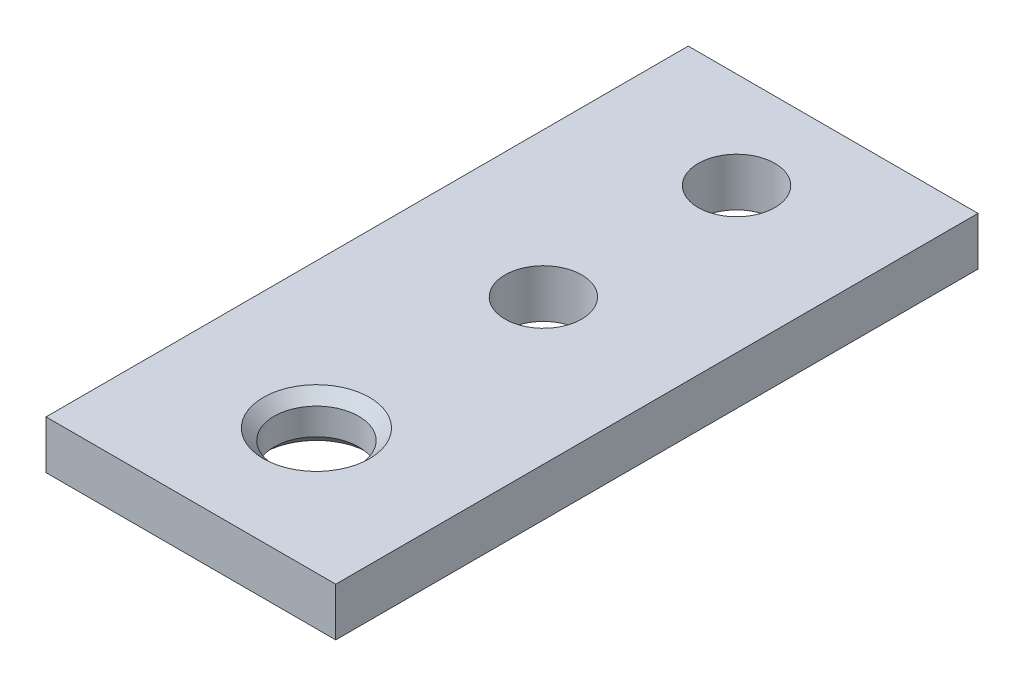
ISO-10303-21;
HEADER;
FILE_DESCRIPTION(('STEP AP214'),'2;1');
FILE_NAME('part.step','',(''),(''),'','','');
FILE_SCHEMA(('AUTOMOTIVE_DESIGN { 1 0 10303 214 1 1 1 1 }'));
ENDSEC;
DATA;
#1=APPLICATION_CONTEXT('core data for automotive mechanical design processes');
#2=APPLICATION_PROTOCOL_DEFINITION('international standard','automotive_design',2000,#1);
#3=PRODUCT_CONTEXT('',#1,'mechanical');
#4=PRODUCT('Part','Part','',(#3));
#5=PRODUCT_RELATED_PRODUCT_CATEGORY('part','',(#4));
#6=PRODUCT_DEFINITION_FORMATION('','',#4);
#7=PRODUCT_DEFINITION_CONTEXT('part definition',#1,'design');
#8=PRODUCT_DEFINITION('design','',#6,#7);
#9=PRODUCT_DEFINITION_SHAPE('','',#8);
#10=(LENGTH_UNIT() NAMED_UNIT(*) SI_UNIT(.MILLI.,.METRE.));
#11=(NAMED_UNIT(*) PLANE_ANGLE_UNIT() SI_UNIT($,.RADIAN.));
#12=(NAMED_UNIT(*) SI_UNIT($,.STERADIAN.) SOLID_ANGLE_UNIT());
#13=UNCERTAINTY_MEASURE_WITH_UNIT(LENGTH_MEASURE(1.E-05),#10,'distance_accuracy_value','');
#14=(GEOMETRIC_REPRESENTATION_CONTEXT(3) GLOBAL_UNCERTAINTY_ASSIGNED_CONTEXT((#13)) GLOBAL_UNIT_ASSIGNED_CONTEXT((#10,
#11,#12)) REPRESENTATION_CONTEXT('',''));
#15=CARTESIAN_POINT('',(0.,0.,0.));
#16=DIRECTION('',(0.,0.,1.));
#17=DIRECTION('',(1.,0.,0.));
#18=AXIS2_PLACEMENT_3D('',#15,#16,#17);
#19=CARTESIAN_POINT('',(19.05,-3.175,84.455));
#20=DIRECTION('',(-1.,0.,0.));
#21=DIRECTION('',(0.,0.,1.));
#22=AXIS2_PLACEMENT_3D('',#19,#20,#21);
#23=PLANE('',#22);
#24=DIRECTION('',(0.,1.,0.));
#25=VECTOR('',#24,1.);
#26=CARTESIAN_POINT('',(19.05,-3.175,0.));
#27=LINE('',#26,#25);
#28=CARTESIAN_POINT('',(19.05,-3.175,0.));
#29=VERTEX_POINT('',#28);
#30=CARTESIAN_POINT('',(19.05,3.175,0.));
#31=VERTEX_POINT('',#30);
#32=EDGE_CURVE('E98',#29,#31,#27,.T.);
#33=ORIENTED_EDGE('',*,*,#32,.T.);
#34=DIRECTION('',(0.,0.,-1.));
#35=VECTOR('',#34,1.);
#36=CARTESIAN_POINT('',(19.05,3.175,84.455));
#37=LINE('',#36,#35);
#38=CARTESIAN_POINT('',(19.05,3.175,84.455));
#39=VERTEX_POINT('',#38);
#40=EDGE_CURVE('E11',#39,#31,#37,.T.);
#41=ORIENTED_EDGE('',*,*,#40,.F.);
#42=DIRECTION('',(0.,1.,0.));
#43=VECTOR('',#42,1.);
#44=CARTESIAN_POINT('',(19.05,-3.175,84.455));
#45=LINE('',#44,#43);
#46=CARTESIAN_POINT('',(19.05,-3.175,84.455));
#47=VERTEX_POINT('',#46);
#48=EDGE_CURVE('E85',#47,#39,#45,.T.);
#49=ORIENTED_EDGE('',*,*,#48,.F.);
#50=DIRECTION('',(0.,0.,-1.));
#51=VECTOR('',#50,1.);
#52=CARTESIAN_POINT('',(19.05,-3.175,84.455));
#53=LINE('',#52,#51);
#54=EDGE_CURVE('E94',#47,#29,#53,.T.);
#55=ORIENTED_EDGE('',*,*,#54,.T.);
#56=EDGE_LOOP('',(#33,#41,#49,#55));
#57=FACE_BOUND('',#56,.T.);
#58=ADVANCED_FACE('F33',(#57),#23,.F.);
#59=CARTESIAN_POINT('',(-19.05,3.175,84.455));
#60=DIRECTION('',(0.,-1.,0.));
#61=DIRECTION('',(0.,0.,-1.));
#62=AXIS2_PLACEMENT_3D('',#59,#60,#61);
#63=PLANE('',#62);
#64=CARTESIAN_POINT('',(0.,3.175,67.945));
#65=DIRECTION('',(0.,1.,0.));
#66=DIRECTION('',(0.,0.,1.));
#67=AXIS2_PLACEMENT_3D('',#64,#65,#66);
#68=CIRCLE('',#67,6.985);
#69=CARTESIAN_POINT('',(0.,3.175,74.93));
#70=VERTEX_POINT('',#69);
#71=EDGE_CURVE('E129',#70,#70,#68,.T.);
#72=ORIENTED_EDGE('',*,*,#71,.F.);
#73=EDGE_LOOP('',(#72));
#74=FACE_BOUND('',#73,.T.);
#75=CARTESIAN_POINT('',(0.,3.175,12.7));
#76=DIRECTION('',(0.,1.,0.));
#77=DIRECTION('',(0.,0.,1.));
#78=AXIS2_PLACEMENT_3D('',#75,#76,#77);
#79=CIRCLE('',#78,5.0419);
#80=CARTESIAN_POINT('',(0.,3.175,17.7419));
#81=VERTEX_POINT('',#80);
#82=EDGE_CURVE('E117',#81,#81,#79,.T.);
#83=ORIENTED_EDGE('',*,*,#82,.F.);
#84=EDGE_LOOP('',(#83));
#85=FACE_BOUND('',#84,.T.);
#86=CARTESIAN_POINT('',(0.,3.175,38.1));
#87=DIRECTION('',(0.,1.,0.));
#88=DIRECTION('',(0.,0.,1.));
#89=AXIS2_PLACEMENT_3D('',#86,#87,#88);
#90=CIRCLE('',#89,5.0419);
#91=CARTESIAN_POINT('',(0.,3.175,43.1419));
#92=VERTEX_POINT('',#91);
#93=EDGE_CURVE('E114',#92,#92,#90,.T.);
#94=ORIENTED_EDGE('',*,*,#93,.F.);
#95=EDGE_LOOP('',(#94));
#96=FACE_BOUND('',#95,.T.);
#97=DIRECTION('',(-1.,0.,0.));
#98=VECTOR('',#97,1.);
#99=CARTESIAN_POINT('',(-19.05,3.175,0.));
#100=LINE('',#99,#98);
#101=CARTESIAN_POINT('',(-19.05,3.175,0.));
#102=VERTEX_POINT('',#101);
#103=EDGE_CURVE('E89',#31,#102,#100,.T.);
#104=ORIENTED_EDGE('',*,*,#103,.T.);
#105=DIRECTION('',(0.,0.,-1.));
#106=VECTOR('',#105,1.);
#107=CARTESIAN_POINT('',(-19.05,3.175,84.455));
#108=LINE('',#107,#106);
#109=CARTESIAN_POINT('',(-19.05,3.175,84.455));
#110=VERTEX_POINT('',#109);
#111=EDGE_CURVE('E42',#110,#102,#108,.T.);
#112=ORIENTED_EDGE('',*,*,#111,.F.);
#113=DIRECTION('',(-1.,0.,0.));
#114=VECTOR('',#113,1.);
#115=CARTESIAN_POINT('',(-19.05,3.175,84.455));
#116=LINE('',#115,#114);
#117=EDGE_CURVE('E80',#39,#110,#116,.T.);
#118=ORIENTED_EDGE('',*,*,#117,.F.);
#119=ORIENTED_EDGE('',*,*,#40,.T.);
#120=EDGE_LOOP('',(#104,#112,#118,#119));
#121=FACE_BOUND('',#120,.T.);
#122=ADVANCED_FACE('F88',(#74,#85,#96,#121),#63,.F.);
#123=CARTESIAN_POINT('',(-19.05,-3.175,84.455));
#124=DIRECTION('',(1.,0.,0.));
#125=DIRECTION('',(0.,0.,-1.));
#126=AXIS2_PLACEMENT_3D('',#123,#124,#125);
#127=PLANE('',#126);
#128=DIRECTION('',(0.,-1.,0.));
#129=VECTOR('',#128,1.);
#130=CARTESIAN_POINT('',(-19.05,-3.175,0.));
#131=LINE('',#130,#129);
#132=CARTESIAN_POINT('',(-19.05,-3.175,0.));
#133=VERTEX_POINT('',#132);
#134=EDGE_CURVE('E67',#102,#133,#131,.T.);
#135=ORIENTED_EDGE('',*,*,#134,.T.);
#136=DIRECTION('',(0.,0.,-1.));
#137=VECTOR('',#136,1.);
#138=CARTESIAN_POINT('',(-19.05,-3.175,84.455));
#139=LINE('',#138,#137);
#140=CARTESIAN_POINT('',(-19.05,-3.175,84.455));
#141=VERTEX_POINT('',#140);
#142=EDGE_CURVE('E90',#141,#133,#139,.T.);
#143=ORIENTED_EDGE('',*,*,#142,.F.);
#144=DIRECTION('',(0.,-1.,0.));
#145=VECTOR('',#144,1.);
#146=CARTESIAN_POINT('',(-19.05,-3.175,84.455));
#147=LINE('',#146,#145);
#148=EDGE_CURVE('E83',#110,#141,#147,.T.);
#149=ORIENTED_EDGE('',*,*,#148,.F.);
#150=ORIENTED_EDGE('',*,*,#111,.T.);
#151=EDGE_LOOP('',(#135,#143,#149,#150));
#152=FACE_BOUND('',#151,.T.);
#153=ADVANCED_FACE('F92',(#152),#127,.F.);
#154=CARTESIAN_POINT('',(-19.05,-3.175,84.455));
#155=DIRECTION('',(0.,1.,0.));
#156=DIRECTION('',(0.,0.,1.));
#157=AXIS2_PLACEMENT_3D('',#154,#155,#156);
#158=PLANE('',#157);
#159=CARTESIAN_POINT('',(0.,-3.175,67.945));
#160=DIRECTION('',(0.,1.,0.));
#161=DIRECTION('',(0.,0.,1.));
#162=AXIS2_PLACEMENT_3D('',#159,#160,#161);
#163=CIRCLE('',#162,6.985);
#164=CARTESIAN_POINT('',(0.,-3.175,74.93));
#165=VERTEX_POINT('',#164);
#166=EDGE_CURVE('E120',#165,#165,#163,.T.);
#167=ORIENTED_EDGE('',*,*,#166,.T.);
#168=EDGE_LOOP('',(#167));
#169=FACE_BOUND('',#168,.T.);
#170=CARTESIAN_POINT('',(0.,-3.175,12.7));
#171=DIRECTION('',(0.,1.,0.));
#172=DIRECTION('',(0.,0.,1.));
#173=AXIS2_PLACEMENT_3D('',#170,#171,#172);
#174=CIRCLE('',#173,5.0419);
#175=CARTESIAN_POINT('',(0.,-3.175,17.7419));
#176=VERTEX_POINT('',#175);
#177=EDGE_CURVE('E36',#176,#176,#174,.T.);
#178=ORIENTED_EDGE('',*,*,#177,.T.);
#179=EDGE_LOOP('',(#178));
#180=FACE_BOUND('',#179,.T.);
#181=CARTESIAN_POINT('',(0.,-3.175,38.1));
#182=DIRECTION('',(0.,1.,0.));
#183=DIRECTION('',(0.,0.,1.));
#184=AXIS2_PLACEMENT_3D('',#181,#182,#183);
#185=CIRCLE('',#184,5.0419);
#186=CARTESIAN_POINT('',(0.,-3.175,43.1419));
#187=VERTEX_POINT('',#186);
#188=EDGE_CURVE('E101',#187,#187,#185,.T.);
#189=ORIENTED_EDGE('',*,*,#188,.T.);
#190=EDGE_LOOP('',(#189));
#191=FACE_BOUND('',#190,.T.);
#192=DIRECTION('',(1.,0.,0.));
#193=VECTOR('',#192,1.);
#194=CARTESIAN_POINT('',(-19.05,-3.175,0.));
#195=LINE('',#194,#193);
#196=EDGE_CURVE('E73',#133,#29,#195,.T.);
#197=ORIENTED_EDGE('',*,*,#196,.T.);
#198=ORIENTED_EDGE('',*,*,#54,.F.);
#199=DIRECTION('',(1.,0.,0.));
#200=VECTOR('',#199,1.);
#201=CARTESIAN_POINT('',(-19.05,-3.175,84.455));
#202=LINE('',#201,#200);
#203=EDGE_CURVE('E50',#141,#47,#202,.T.);
#204=ORIENTED_EDGE('',*,*,#203,.F.);
#205=ORIENTED_EDGE('',*,*,#142,.T.);
#206=EDGE_LOOP('',(#197,#198,#204,#205));
#207=FACE_BOUND('',#206,.T.);
#208=ADVANCED_FACE('F106',(#169,#180,#191,#207),#158,.F.);
#209=CARTESIAN_POINT('',(19.05,3.175,84.455));
#210=DIRECTION('',(0.,0.,-1.));
#211=DIRECTION('',(-1.,0.,0.));
#212=AXIS2_PLACEMENT_3D('',#209,#210,#211);
#213=PLANE('',#212);
#214=ORIENTED_EDGE('',*,*,#48,.T.);
#215=ORIENTED_EDGE('',*,*,#117,.T.);
#216=ORIENTED_EDGE('',*,*,#148,.T.);
#217=ORIENTED_EDGE('',*,*,#203,.T.);
#218=EDGE_LOOP('',(#214,#215,#216,#217));
#219=FACE_BOUND('',#218,.T.);
#220=ADVANCED_FACE('F81',(#219),#213,.F.);
#221=CARTESIAN_POINT('',(19.05,3.175,0.));
#222=DIRECTION('',(0.,0.,-1.));
#223=DIRECTION('',(-1.,0.,0.));
#224=AXIS2_PLACEMENT_3D('',#221,#222,#223);
#225=PLANE('',#224);
#226=ORIENTED_EDGE('',*,*,#32,.F.);
#227=ORIENTED_EDGE('',*,*,#196,.F.);
#228=ORIENTED_EDGE('',*,*,#134,.F.);
#229=ORIENTED_EDGE('',*,*,#103,.F.);
#230=EDGE_LOOP('',(#226,#227,#228,#229));
#231=FACE_BOUND('',#230,.T.);
#232=ADVANCED_FACE('F109',(#231),#225,.T.);
#233=CARTESIAN_POINT('',(0.,3.175,38.1));
#234=DIRECTION('',(0.,1.,0.));
#235=DIRECTION('',(0.,0.,1.));
#236=AXIS2_PLACEMENT_3D('',#233,#234,#235);
#237=CYLINDRICAL_SURFACE('',#236,5.0419);
#238=ORIENTED_EDGE('',*,*,#93,.T.);
#239=EDGE_LOOP('',(#238));
#240=FACE_BOUND('',#239,.T.);
#241=ORIENTED_EDGE('',*,*,#188,.F.);
#242=EDGE_LOOP('',(#241));
#243=FACE_BOUND('',#242,.T.);
#244=ADVANCED_FACE('F141',(#240,#243),#237,.F.);
#245=CARTESIAN_POINT('',(0.,3.175,12.7));
#246=DIRECTION('',(0.,1.,0.));
#247=DIRECTION('',(0.,0.,1.));
#248=AXIS2_PLACEMENT_3D('',#245,#246,#247);
#249=CYLINDRICAL_SURFACE('',#248,5.0419);
#250=ORIENTED_EDGE('',*,*,#82,.T.);
#251=EDGE_LOOP('',(#250));
#252=FACE_BOUND('',#251,.T.);
#253=ORIENTED_EDGE('',*,*,#177,.F.);
#254=EDGE_LOOP('',(#253));
#255=FACE_BOUND('',#254,.T.);
#256=ADVANCED_FACE('F144',(#252,#255),#249,.F.);
#257=CARTESIAN_POINT('',(0.,-1.74625,67.945));
#258=DIRECTION('',(0.,-1.,0.));
#259=DIRECTION('',(0.,0.,-1.));
#260=AXIS2_PLACEMENT_3D('',#257,#258,#259);
#261=CONICAL_SURFACE('',#260,5.55625,0.785398163397447);
#262=ORIENTED_EDGE('',*,*,#166,.F.);
#263=EDGE_LOOP('',(#262));
#264=FACE_BOUND('',#263,.T.);
#265=CARTESIAN_POINT('',(0.,-1.74625,67.945));
#266=DIRECTION('',(0.,1.,0.));
#267=DIRECTION('',(0.,0.,1.));
#268=AXIS2_PLACEMENT_3D('',#265,#266,#267);
#269=CIRCLE('',#268,5.55625);
#270=CARTESIAN_POINT('',(0.,-1.74625,73.50125));
#271=VERTEX_POINT('',#270);
#272=EDGE_CURVE('E123',#271,#271,#269,.T.);
#273=ORIENTED_EDGE('',*,*,#272,.T.);
#274=EDGE_LOOP('',(#273));
#275=FACE_BOUND('',#274,.T.);
#276=ADVANCED_FACE('F198',(#264,#275),#261,.F.);
#277=CARTESIAN_POINT('',(0.,3.175,67.945));
#278=DIRECTION('',(0.,1.,0.));
#279=DIRECTION('',(0.,0.,1.));
#280=AXIS2_PLACEMENT_3D('',#277,#278,#279);
#281=CYLINDRICAL_SURFACE('',#280,5.55625);
#282=ORIENTED_EDGE('',*,*,#272,.F.);
#283=EDGE_LOOP('',(#282));
#284=FACE_BOUND('',#283,.T.);
#285=CARTESIAN_POINT('',(0.,1.74625,67.945));
#286=DIRECTION('',(0.,1.,0.));
#287=DIRECTION('',(0.,0.,1.));
#288=AXIS2_PLACEMENT_3D('',#285,#286,#287);
#289=CIRCLE('',#288,5.55625);
#290=CARTESIAN_POINT('',(0.,1.74625,73.50125));
#291=VERTEX_POINT('',#290);
#292=EDGE_CURVE('E126',#291,#291,#289,.T.);
#293=ORIENTED_EDGE('',*,*,#292,.T.);
#294=EDGE_LOOP('',(#293));
#295=FACE_BOUND('',#294,.T.);
#296=ADVANCED_FACE('F209',(#284,#295),#281,.F.);
#297=CARTESIAN_POINT('',(0.,3.175,67.945));
#298=DIRECTION('',(0.,1.,0.));
#299=DIRECTION('',(0.,0.,1.));
#300=AXIS2_PLACEMENT_3D('',#297,#298,#299);
#301=CONICAL_SURFACE('',#300,6.985,0.785398163397449);
#302=ORIENTED_EDGE('',*,*,#292,.F.);
#303=EDGE_LOOP('',(#302));
#304=FACE_BOUND('',#303,.T.);
#305=ORIENTED_EDGE('',*,*,#71,.T.);
#306=EDGE_LOOP('',(#305));
#307=FACE_BOUND('',#306,.T.);
#308=ADVANCED_FACE('F133',(#304,#307),#301,.F.);
#309=CLOSED_SHELL('',(#58,#122,#153,#208,#220,#232,#244,#256,#276,#296,#308));
#310=MANIFOLD_SOLID_BREP('B2',#309);
#311=ADVANCED_BREP_SHAPE_REPRESENTATION('',(#18,#310),#14);
#312=SHAPE_DEFINITION_REPRESENTATION(#9,#311);
ENDSEC;
END-ISO-10303-21;
